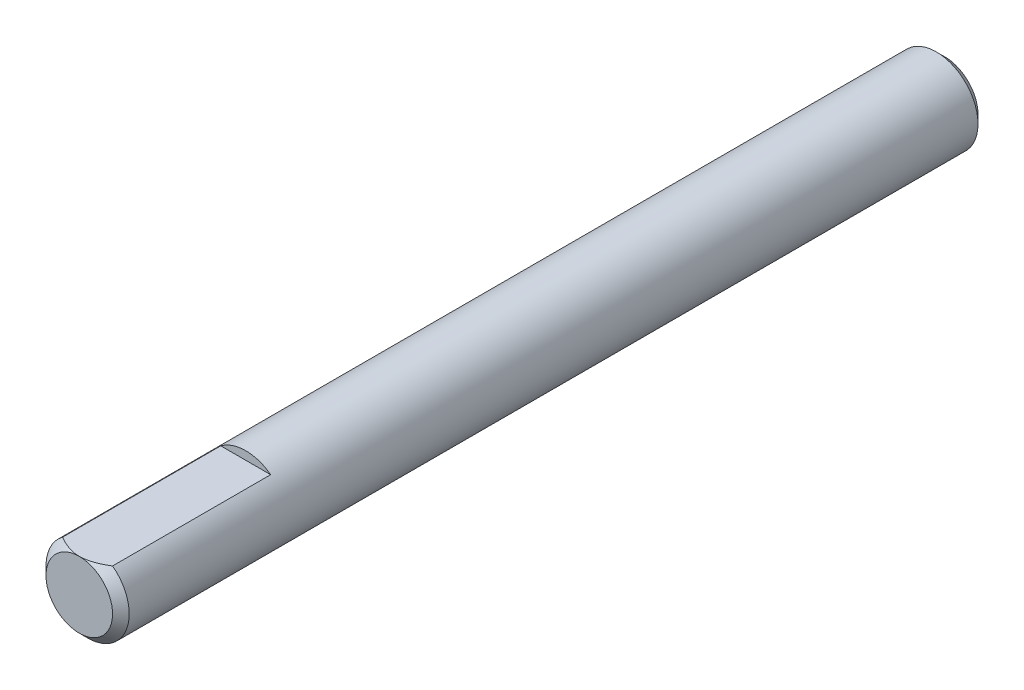
ISO-10303-21;
HEADER;
FILE_DESCRIPTION(('STEP AP214'),'2;1');
FILE_NAME('part.step','',(''),(''),'','','');
FILE_SCHEMA(('AUTOMOTIVE_DESIGN { 1 0 10303 214 1 1 1 1 }'));
ENDSEC;
DATA;
#1=APPLICATION_CONTEXT('core data for automotive mechanical design processes');
#2=APPLICATION_PROTOCOL_DEFINITION('international standard','automotive_design',2000,#1);
#3=PRODUCT_CONTEXT('',#1,'mechanical');
#4=PRODUCT('Part','Part','',(#3));
#5=PRODUCT_RELATED_PRODUCT_CATEGORY('part','',(#4));
#6=PRODUCT_DEFINITION_FORMATION('','',#4);
#7=PRODUCT_DEFINITION_CONTEXT('part definition',#1,'design');
#8=PRODUCT_DEFINITION('design','',#6,#7);
#9=PRODUCT_DEFINITION_SHAPE('','',#8);
#10=(LENGTH_UNIT() NAMED_UNIT(*) SI_UNIT(.MILLI.,.METRE.));
#11=(NAMED_UNIT(*) PLANE_ANGLE_UNIT() SI_UNIT($,.RADIAN.));
#12=(NAMED_UNIT(*) SI_UNIT($,.STERADIAN.) SOLID_ANGLE_UNIT());
#13=UNCERTAINTY_MEASURE_WITH_UNIT(LENGTH_MEASURE(1.E-05),#10,'distance_accuracy_value','');
#14=(GEOMETRIC_REPRESENTATION_CONTEXT(3) GLOBAL_UNCERTAINTY_ASSIGNED_CONTEXT((#13)) GLOBAL_UNIT_ASSIGNED_CONTEXT((#10,
#11,#12)) REPRESENTATION_CONTEXT('',''));
#15=CARTESIAN_POINT('',(0.,0.,0.));
#16=DIRECTION('',(0.,0.,1.));
#17=DIRECTION('',(1.,0.,0.));
#18=AXIS2_PLACEMENT_3D('',#15,#16,#17);
#19=CARTESIAN_POINT('',(0.,0.,-52.));
#20=DIRECTION('',(0.,0.,1.));
#21=DIRECTION('',(1.,0.,0.));
#22=AXIS2_PLACEMENT_3D('',#19,#20,#21);
#23=CYLINDRICAL_SURFACE('',#22,2.5);
#24=DIRECTION('',(0.,0.,1.));
#25=VECTOR('',#24,1.);
#26=CARTESIAN_POINT('',(1.5,2.,-10.));
#27=LINE('',#26,#25);
#28=CARTESIAN_POINT('',(1.5,2.,-10.));
#29=VERTEX_POINT('',#28);
#30=CARTESIAN_POINT('',(1.5,2.,-0.49999999999998));
#31=VERTEX_POINT('',#30);
#32=EDGE_CURVE('E78',#29,#31,#27,.T.);
#33=ORIENTED_EDGE('',*,*,#32,.T.);
#34=CARTESIAN_POINT('',(0.,0.,-0.49999999999998));
#35=DIRECTION('',(0.,0.,1.));
#36=DIRECTION('',(1.,0.,0.));
#37=AXIS2_PLACEMENT_3D('',#34,#35,#36);
#38=CIRCLE('',#37,2.5);
#39=CARTESIAN_POINT('',(-1.5,2.,-0.49999999999998));
#40=VERTEX_POINT('',#39);
#41=EDGE_CURVE('E83',#31,#40,#38,.F.);
#42=ORIENTED_EDGE('',*,*,#41,.T.);
#43=DIRECTION('',(0.,0.,1.));
#44=VECTOR('',#43,1.);
#45=CARTESIAN_POINT('',(-1.5,2.,-10.));
#46=LINE('',#45,#44);
#47=CARTESIAN_POINT('',(-1.5,2.,-10.));
#48=VERTEX_POINT('',#47);
#49=EDGE_CURVE('E77',#48,#40,#46,.T.);
#50=ORIENTED_EDGE('',*,*,#49,.F.);
#51=CARTESIAN_POINT('',(0.,0.,-10.));
#52=DIRECTION('',(0.,0.,1.));
#53=DIRECTION('',(1.,0.,0.));
#54=AXIS2_PLACEMENT_3D('',#51,#52,#53);
#55=CIRCLE('',#54,2.5);
#56=EDGE_CURVE('E69',#29,#48,#55,.T.);
#57=ORIENTED_EDGE('',*,*,#56,.F.);
#58=EDGE_LOOP('',(#33,#42,#50,#57));
#59=FACE_BOUND('',#58,.T.);
#60=CARTESIAN_POINT('',(0.,0.,-51.5));
#61=DIRECTION('',(0.,0.,1.));
#62=DIRECTION('',(1.,0.,0.));
#63=AXIS2_PLACEMENT_3D('',#60,#61,#62);
#64=CIRCLE('',#63,2.5);
#65=CARTESIAN_POINT('',(2.5,0.,-51.5));
#66=VERTEX_POINT('',#65);
#67=EDGE_CURVE('E88',#66,#66,#64,.T.);
#68=ORIENTED_EDGE('',*,*,#67,.T.);
#69=EDGE_LOOP('',(#68));
#70=FACE_BOUND('',#69,.T.);
#71=ADVANCED_FACE('F35',(#59,#70),#23,.T.);
#72=CARTESIAN_POINT('',(0.,0.,-52.));
#73=DIRECTION('',(0.,0.,1.));
#74=DIRECTION('',(1.,0.,0.));
#75=AXIS2_PLACEMENT_3D('',#72,#73,#74);
#76=PLANE('',#75);
#77=CARTESIAN_POINT('',(0.,0.,-52.));
#78=DIRECTION('',(0.,0.,1.));
#79=DIRECTION('',(1.,0.,0.));
#80=AXIS2_PLACEMENT_3D('',#77,#78,#79);
#81=CIRCLE('',#80,1.99999999999998);
#82=CARTESIAN_POINT('',(1.99999999999998,0.,-52.));
#83=VERTEX_POINT('',#82);
#84=EDGE_CURVE('E91',#83,#83,#81,.F.);
#85=ORIENTED_EDGE('',*,*,#84,.T.);
#86=EDGE_LOOP('',(#85));
#87=FACE_BOUND('',#86,.T.);
#88=ADVANCED_FACE('F107',(#87),#76,.F.);
#89=CARTESIAN_POINT('',(0.,0.,0.));
#90=DIRECTION('',(0.,0.,1.));
#91=DIRECTION('',(1.,0.,0.));
#92=AXIS2_PLACEMENT_3D('',#89,#90,#91);
#93=PLANE('',#92);
#94=CARTESIAN_POINT('',(0.,0.,0.));
#95=DIRECTION('',(0.,0.,1.));
#96=DIRECTION('',(1.,0.,0.));
#97=AXIS2_PLACEMENT_3D('',#94,#95,#96);
#98=CIRCLE('',#97,2.00000000000002);
#99=CARTESIAN_POINT('',(0.,2.00000000000002,0.));
#100=VERTEX_POINT('',#99);
#101=EDGE_CURVE('E93',#100,#100,#98,.T.);
#102=ORIENTED_EDGE('',*,*,#101,.T.);
#103=EDGE_LOOP('',(#102));
#104=FACE_BOUND('',#103,.T.);
#105=ADVANCED_FACE('F97',(#104),#93,.T.);
#106=CARTESIAN_POINT('',(0.,0.,-51.5));
#107=DIRECTION('',(0.,0.,1.));
#108=DIRECTION('',(1.,0.,0.));
#109=AXIS2_PLACEMENT_3D('',#106,#107,#108);
#110=CONICAL_SURFACE('',#109,2.5,0.785398163397446);
#111=ORIENTED_EDGE('',*,*,#84,.F.);
#112=EDGE_LOOP('',(#111));
#113=FACE_BOUND('',#112,.T.);
#114=ORIENTED_EDGE('',*,*,#67,.F.);
#115=EDGE_LOOP('',(#114));
#116=FACE_BOUND('',#115,.T.);
#117=ADVANCED_FACE('F100',(#113,#116),#110,.T.);
#118=CARTESIAN_POINT('',(0.,0.,0.));
#119=DIRECTION('',(0.,0.,-1.));
#120=DIRECTION('',(-1.,0.,0.));
#121=AXIS2_PLACEMENT_3D('',#118,#119,#120);
#122=CONICAL_SURFACE('',#121,2.00000000000002,0.785398163397453);
#123=CARTESIAN_POINT('',(-4.5415812651491,2.,-2.96245507666849));
#124=CARTESIAN_POINT('',(-4.4078818119162,2.,-2.84013171640833));
#125=CARTESIAN_POINT('',(-4.27377676298087,2.,-2.71824473030547));
#126=CARTESIAN_POINT('',(-4.00441181894497,2.,-2.47568838393381));
#127=CARTESIAN_POINT('',(-3.86915165044023,2.,-2.35501932756028));
#128=CARTESIAN_POINT('',(-3.59627179916654,2.,-2.11448758408414));
#129=CARTESIAN_POINT('',(-3.45864232149435,2.,-1.99463598191347));
#130=CARTESIAN_POINT('',(-3.18146224877806,2.,-1.75720178068561));
#131=CARTESIAN_POINT('',(-3.04191190170419,2.,-1.63961889337445));
#132=CARTESIAN_POINT('',(-2.78304162114768,2.,-1.4264912207552));
#133=CARTESIAN_POINT('',(-2.66411646269425,2.,-1.33046837471153));
#134=CARTESIAN_POINT('',(-2.4238112804611,2.,-1.14154898584778));
#135=CARTESIAN_POINT('',(-2.30243150523255,2.,-1.04865212900686));
#136=CARTESIAN_POINT('',(-2.05648675139779,2.,-0.867441884855726));
#137=CARTESIAN_POINT('',(-1.93192548855324,2.,-0.779123485557222));
#138=CARTESIAN_POINT('',(-1.67832650533052,2.,-0.609189749898308));
#139=CARTESIAN_POINT('',(-1.54929155150697,2.,-0.527570372401743));
#140=CARTESIAN_POINT('',(-1.35234218728429,2.,-0.413724275899852));
#141=CARTESIAN_POINT('',(-1.28675354615695,2.,-0.377505420438063));
#142=CARTESIAN_POINT('',(-1.15389881618029,2.,-0.308301228183812));
#143=CARTESIAN_POINT('',(-1.08663239772489,2.,-0.275316533132033));
#144=CARTESIAN_POINT('',(-0.882147887818565,2.,-0.182534574894075));
#145=CARTESIAN_POINT('',(-0.741960865255786,2.,-0.128737288079579));
#146=CARTESIAN_POINT('',(-0.540586616624982,2.,-0.0710365445520645));
#147=CARTESIAN_POINT('',(-0.482393823466949,2.,-0.0565518342326606));
#148=CARTESIAN_POINT('',(-0.365054534906707,2.,-0.0322338921891067));
#149=CARTESIAN_POINT('',(-0.305908538894943,2.,-0.0223983017451442));
#150=CARTESIAN_POINT('',(-0.187116304227603,2.,-0.00787135033614125));
#151=CARTESIAN_POINT('',(-0.127471499357723,2.,-0.00316840605407094));
#152=CARTESIAN_POINT('',(-0.00799755618429781,2.,0.000875080349941214));
#153=CARTESIAN_POINT('',(0.0518315799961802,2.,0.000215684004443749));
#154=CARTESIAN_POINT('',(0.171136691508554,2.,-0.006425220417185));
#155=CARTESIAN_POINT('',(0.230612928119924,2.,-0.0124021124051133));
#156=CARTESIAN_POINT('',(0.348851515288014,2.,-0.0293523382902971));
#157=CARTESIAN_POINT('',(0.407613705899134,2.,-0.0403267711965909));
#158=CARTESIAN_POINT('',(0.524272722217905,2.,-0.066790499457437));
#159=CARTESIAN_POINT('',(0.582166656469484,2.,-0.0822923792313864));
#160=CARTESIAN_POINT('',(0.696753144524343,2.,-0.11718804776439));
#161=CARTESIAN_POINT('',(0.753445725462681,2.,-0.136581748514776));
#162=CARTESIAN_POINT('',(0.880815513203981,2.,-0.184368283778935));
#163=CARTESIAN_POINT('',(0.951110458492483,2.,-0.213774816138279));
#164=CARTESIAN_POINT('',(1.08979682065663,2.,-0.276804491642873));
#165=CARTESIAN_POINT('',(1.15818731300015,2.,-0.310429640600152));
#166=CARTESIAN_POINT('',(1.29334598310595,2.,-0.381053652178616));
#167=CARTESIAN_POINT('',(1.36011104794882,2.,-0.418058428312601));
#168=CARTESIAN_POINT('',(1.49211837962191,2.,-0.494701764306472));
#169=CARTESIAN_POINT('',(1.5573603389265,2.,-0.534340849942228));
#170=CARTESIAN_POINT('',(1.75245026986077,2.,-0.657206609229));
#171=CARTESIAN_POINT('',(1.88028010154233,2.,-0.743631141314398));
#172=CARTESIAN_POINT('',(2.13206514947158,2.,-0.921959247064005));
#173=CARTESIAN_POINT('',(2.25601879057796,2.,-1.01386500510377));
#174=CARTESIAN_POINT('',(2.47468073216874,2.,-1.18123147987931));
#175=CARTESIAN_POINT('',(2.56994146298304,2.,-1.25597420404401));
#176=CARTESIAN_POINT('',(2.7590322580672,2.,-1.40720528592454));
#177=CARTESIAN_POINT('',(2.85286259771341,2.,-1.48369330037595));
#178=CARTESIAN_POINT('',(3.13279656707032,2.,-1.71528473125296));
#179=CARTESIAN_POINT('',(3.31721829949496,2.,-1.87241820264812));
#180=CARTESIAN_POINT('',(3.67605880130078,2.,-2.18400198642693));
#181=CARTESIAN_POINT('',(3.85058989647264,2.,-2.33832397466066));
#182=CARTESIAN_POINT('',(4.11082385200208,2.,-2.57136693491412));
#183=CARTESIAN_POINT('',(4.19726354267214,2.,-2.649267032624));
#184=CARTESIAN_POINT('',(4.36972140089703,2.,-2.80553233187687));
#185=CARTESIAN_POINT('',(4.45573956903519,2.,-2.88389753277587));
#186=CARTESIAN_POINT('',(4.5415812651491,2.,-2.96245507666849));
#187=B_SPLINE_CURVE_WITH_KNOTS('',3,(#123,#124,#125,#126,#127,#128,#129,#130,#131,#132,#133,
#134,#135,#136,#137,#138,#139,#140,#141,#142,#143,#144,#145,#146,#147,#148,#149,#150,#151,#152,
#153,#154,#155,#156,#157,#158,#159,#160,#161,#162,#163,#164,#165,#166,#167,#168,#169,#170,#171,
#172,#173,#174,#175,#176,#177,#178,#179,#180,#181,#182,#183,#184,#185,#186),.UNSPECIFIED.,.F.,
.F.,(4,2,2,2,2,2,2,2,2,2,2,2,2,2,2,2,2,2,2,2,2,2,2,2,2,2,2,2,2,2,2,4),(0.,0.543648433409253,
1.08742932032406,1.63491277727773,2.18232620888326,2.64084565815797,3.09931890857656,
3.55727918948918,4.0149611470584,4.23964636575803,4.46437607794634,4.91284380564595,
5.09259837509898,5.27226164835583,5.45151861505672,5.63077352479677,5.80987297602421,
5.98901183203951,6.16865343712791,6.34829098030363,6.57670171755535,6.80522147105068,
7.03414903195559,7.26312242201858,7.72577744460036,8.18861809251005,8.55184113123089,
8.91499333659397,9.64177244839396,10.3406699979885,10.6897561547734,11.0388418283191),.UNSPECIFIED.);
#188=EDGE_CURVE('E11',#40,#100,#187,.T.);
#189=ORIENTED_EDGE('',*,*,#188,.F.);
#190=ORIENTED_EDGE('',*,*,#41,.F.);
#191=EDGE_CURVE('E41',#100,#31,#187,.T.);
#192=ORIENTED_EDGE('',*,*,#191,.F.);
#193=ORIENTED_EDGE('',*,*,#101,.F.);
#194=EDGE_LOOP('',(#189,#190,#192,#193));
#195=FACE_BOUND('',#194,.T.);
#196=ADVANCED_FACE('F38',(#195),#122,.T.);
#197=CARTESIAN_POINT('',(-1.5,2.,-10.));
#198=DIRECTION('',(0.,-1.,0.));
#199=DIRECTION('',(0.,0.,-1.));
#200=AXIS2_PLACEMENT_3D('',#197,#198,#199);
#201=PLANE('',#200);
#202=ORIENTED_EDGE('',*,*,#188,.T.);
#203=ORIENTED_EDGE('',*,*,#191,.T.);
#204=ORIENTED_EDGE('',*,*,#32,.F.);
#205=DIRECTION('',(1.,0.,0.));
#206=VECTOR('',#205,1.);
#207=CARTESIAN_POINT('',(-1.5,2.,-10.));
#208=LINE('',#207,#206);
#209=EDGE_CURVE('E72',#48,#29,#208,.T.);
#210=ORIENTED_EDGE('',*,*,#209,.F.);
#211=ORIENTED_EDGE('',*,*,#49,.T.);
#212=EDGE_LOOP('',(#202,#203,#204,#210,#211));
#213=FACE_BOUND('',#212,.T.);
#214=ADVANCED_FACE('F76',(#213),#201,.F.);
#215=CARTESIAN_POINT('',(0.,0.,-10.));
#216=DIRECTION('',(0.,0.,1.));
#217=DIRECTION('',(1.,0.,0.));
#218=AXIS2_PLACEMENT_3D('',#215,#216,#217);
#219=PLANE('',#218);
#220=ORIENTED_EDGE('',*,*,#56,.T.);
#221=ORIENTED_EDGE('',*,*,#209,.T.);
#222=EDGE_LOOP('',(#220,#221));
#223=FACE_BOUND('',#222,.T.);
#224=ADVANCED_FACE('F71',(#223),#219,.T.);
#225=CLOSED_SHELL('',(#71,#88,#105,#117,#196,#214,#224));
#226=MANIFOLD_SOLID_BREP('B2',#225);
#227=ADVANCED_BREP_SHAPE_REPRESENTATION('',(#18,#226),#14);
#228=SHAPE_DEFINITION_REPRESENTATION(#9,#227);
ENDSEC;
END-ISO-10303-21;
